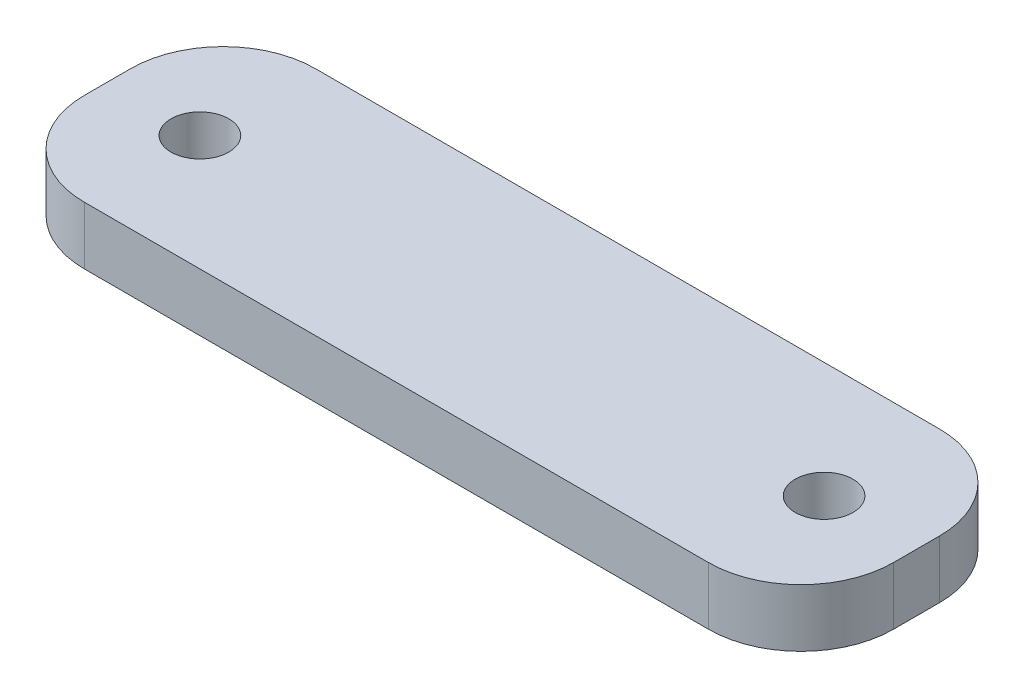
ISO-10303-21;
HEADER;
FILE_DESCRIPTION(('STEP AP214'),'2;1');
FILE_NAME('part.step','',(''),(''),'','','');
FILE_SCHEMA(('AUTOMOTIVE_DESIGN { 1 0 10303 214 1 1 1 1 }'));
ENDSEC;
DATA;
#1=APPLICATION_CONTEXT('core data for automotive mechanical design processes');
#2=APPLICATION_PROTOCOL_DEFINITION('international standard','automotive_design',2000,#1);
#3=PRODUCT_CONTEXT('',#1,'mechanical');
#4=PRODUCT('Part','Part','',(#3));
#5=PRODUCT_RELATED_PRODUCT_CATEGORY('part','',(#4));
#6=PRODUCT_DEFINITION_FORMATION('','',#4);
#7=PRODUCT_DEFINITION_CONTEXT('part definition',#1,'design');
#8=PRODUCT_DEFINITION('design','',#6,#7);
#9=PRODUCT_DEFINITION_SHAPE('','',#8);
#10=(LENGTH_UNIT() NAMED_UNIT(*) SI_UNIT(.MILLI.,.METRE.));
#11=(NAMED_UNIT(*) PLANE_ANGLE_UNIT() SI_UNIT($,.RADIAN.));
#12=(NAMED_UNIT(*) SI_UNIT($,.STERADIAN.) SOLID_ANGLE_UNIT());
#13=UNCERTAINTY_MEASURE_WITH_UNIT(LENGTH_MEASURE(1.E-05),#10,'distance_accuracy_value','');
#14=(GEOMETRIC_REPRESENTATION_CONTEXT(3) GLOBAL_UNCERTAINTY_ASSIGNED_CONTEXT((#13)) GLOBAL_UNIT_ASSIGNED_CONTEXT((#10,
#11,#12)) REPRESENTATION_CONTEXT('',''));
#15=CARTESIAN_POINT('',(0.,0.,0.));
#16=DIRECTION('',(0.,0.,1.));
#17=DIRECTION('',(1.,0.,0.));
#18=AXIS2_PLACEMENT_3D('',#15,#16,#17);
#19=CARTESIAN_POINT('',(8.,5.,12.));
#20=DIRECTION('',(0.,1.,0.));
#21=DIRECTION('',(0.,0.,1.));
#22=AXIS2_PLACEMENT_3D('',#19,#20,#21);
#23=PLANE('',#22);
#24=CARTESIAN_POINT('',(8.00000000000006,5.,10.));
#25=DIRECTION('',(0.,1.,0.));
#26=DIRECTION('',(0.,0.,1.));
#27=AXIS2_PLACEMENT_3D('',#24,#25,#26);
#28=CIRCLE('',#27,2.5);
#29=CARTESIAN_POINT('',(8.00000000000006,5.,12.5));
#30=VERTEX_POINT('',#29);
#31=EDGE_CURVE('E134',#30,#30,#28,.T.);
#32=ORIENTED_EDGE('',*,*,#31,.F.);
#33=EDGE_LOOP('',(#32));
#34=FACE_BOUND('',#33,.T.);
#35=CARTESIAN_POINT('',(8.,5.,12.));
#36=DIRECTION('',(0.,1.,0.));
#37=DIRECTION('',(0.,0.,1.));
#38=AXIS2_PLACEMENT_3D('',#35,#36,#37);
#39=CIRCLE('',#38,8.);
#40=CARTESIAN_POINT('',(0.,5.,11.9999999999999));
#41=VERTEX_POINT('',#40);
#42=CARTESIAN_POINT('',(8.00000000000006,5.,20.));
#43=VERTEX_POINT('',#42);
#44=EDGE_CURVE('E145',#41,#43,#39,.T.);
#45=ORIENTED_EDGE('',*,*,#44,.T.);
#46=DIRECTION('',(1.,0.,0.));
#47=VECTOR('',#46,1.);
#48=CARTESIAN_POINT('',(8.00000000000006,5.,20.));
#49=LINE('',#48,#47);
#50=CARTESIAN_POINT('',(62.,5.,20.));
#51=VERTEX_POINT('',#50);
#52=EDGE_CURVE('E93',#43,#51,#49,.T.);
#53=ORIENTED_EDGE('',*,*,#52,.T.);
#54=CARTESIAN_POINT('',(62.,5.,12.));
#55=DIRECTION('',(0.,1.,0.));
#56=DIRECTION('',(0.,0.,1.));
#57=AXIS2_PLACEMENT_3D('',#54,#55,#56);
#58=CIRCLE('',#57,8.);
#59=CARTESIAN_POINT('',(70.,5.,12.));
#60=VERTEX_POINT('',#59);
#61=EDGE_CURVE('E160',#51,#60,#58,.T.);
#62=ORIENTED_EDGE('',*,*,#61,.T.);
#63=DIRECTION('',(0.,0.,-1.));
#64=VECTOR('',#63,1.);
#65=CARTESIAN_POINT('',(70.,5.,8.));
#66=LINE('',#65,#64);
#67=CARTESIAN_POINT('',(70.,5.,8.));
#68=VERTEX_POINT('',#67);
#69=EDGE_CURVE('E173',#60,#68,#66,.T.);
#70=ORIENTED_EDGE('',*,*,#69,.T.);
#71=CARTESIAN_POINT('',(62.,5.,8.));
#72=DIRECTION('',(0.,1.,0.));
#73=DIRECTION('',(0.,0.,-1.));
#74=AXIS2_PLACEMENT_3D('',#71,#72,#73);
#75=CIRCLE('',#74,8.);
#76=CARTESIAN_POINT('',(62.,5.,0.));
#77=VERTEX_POINT('',#76);
#78=EDGE_CURVE('E112',#68,#77,#75,.T.);
#79=ORIENTED_EDGE('',*,*,#78,.T.);
#80=DIRECTION('',(-1.,0.,0.));
#81=VECTOR('',#80,1.);
#82=CARTESIAN_POINT('',(8.00000000000006,5.,0.));
#83=LINE('',#82,#81);
#84=CARTESIAN_POINT('',(8.00000000000006,5.,0.));
#85=VERTEX_POINT('',#84);
#86=EDGE_CURVE('E106',#77,#85,#83,.T.);
#87=ORIENTED_EDGE('',*,*,#86,.T.);
#88=CARTESIAN_POINT('',(8.,5.,8.));
#89=DIRECTION('',(0.,1.,0.));
#90=DIRECTION('',(0.,0.,1.));
#91=AXIS2_PLACEMENT_3D('',#88,#89,#90);
#92=CIRCLE('',#91,8.);
#93=CARTESIAN_POINT('',(0.,5.,8.00000000000006));
#94=VERTEX_POINT('',#93);
#95=EDGE_CURVE('E110',#85,#94,#92,.T.);
#96=ORIENTED_EDGE('',*,*,#95,.T.);
#97=DIRECTION('',(0.,0.,1.));
#98=VECTOR('',#97,1.);
#99=CARTESIAN_POINT('',(0.,5.,8.00000000000006));
#100=LINE('',#99,#98);
#101=EDGE_CURVE('E50',#94,#41,#100,.T.);
#102=ORIENTED_EDGE('',*,*,#101,.T.);
#103=EDGE_LOOP('',(#45,#53,#62,#70,#79,#87,#96,#102));
#104=FACE_BOUND('',#103,.T.);
#105=CARTESIAN_POINT('',(62.,5.,10.));
#106=DIRECTION('',(0.,1.,0.));
#107=DIRECTION('',(0.,0.,-1.));
#108=AXIS2_PLACEMENT_3D('',#105,#106,#107);
#109=CIRCLE('',#108,2.5);
#110=CARTESIAN_POINT('',(62.,5.,7.5));
#111=VERTEX_POINT('',#110);
#112=EDGE_CURVE('E182',#111,#111,#109,.T.);
#113=ORIENTED_EDGE('',*,*,#112,.F.);
#114=EDGE_LOOP('',(#113));
#115=FACE_BOUND('',#114,.T.);
#116=ADVANCED_FACE('F33',(#34,#104,#115),#23,.T.);
#117=CARTESIAN_POINT('',(8.,0.,12.));
#118=DIRECTION('',(0.,1.,0.));
#119=DIRECTION('',(0.,0.,1.));
#120=AXIS2_PLACEMENT_3D('',#117,#118,#119);
#121=PLANE('',#120);
#122=CARTESIAN_POINT('',(8.,0.,12.));
#123=DIRECTION('',(0.,1.,0.));
#124=DIRECTION('',(0.,0.,1.));
#125=AXIS2_PLACEMENT_3D('',#122,#123,#124);
#126=CIRCLE('',#125,8.);
#127=CARTESIAN_POINT('',(0.,0.,11.9999999999999));
#128=VERTEX_POINT('',#127);
#129=CARTESIAN_POINT('',(8.00000000000006,0.,20.));
#130=VERTEX_POINT('',#129);
#131=EDGE_CURVE('E130',#128,#130,#126,.T.);
#132=ORIENTED_EDGE('',*,*,#131,.F.);
#133=DIRECTION('',(0.,0.,1.));
#134=VECTOR('',#133,1.);
#135=CARTESIAN_POINT('',(0.,0.,8.00000000000006));
#136=LINE('',#135,#134);
#137=CARTESIAN_POINT('',(0.,0.,8.00000000000006));
#138=VERTEX_POINT('',#137);
#139=EDGE_CURVE('E85',#138,#128,#136,.T.);
#140=ORIENTED_EDGE('',*,*,#139,.F.);
#141=CARTESIAN_POINT('',(8.,0.,8.));
#142=DIRECTION('',(0.,1.,0.));
#143=DIRECTION('',(0.,0.,1.));
#144=AXIS2_PLACEMENT_3D('',#141,#142,#143);
#145=CIRCLE('',#144,8.);
#146=CARTESIAN_POINT('',(8.00000000000006,0.,0.));
#147=VERTEX_POINT('',#146);
#148=EDGE_CURVE('E79',#147,#138,#145,.T.);
#149=ORIENTED_EDGE('',*,*,#148,.F.);
#150=DIRECTION('',(-1.,0.,0.));
#151=VECTOR('',#150,1.);
#152=CARTESIAN_POINT('',(8.00000000000006,0.,0.));
#153=LINE('',#152,#151);
#154=CARTESIAN_POINT('',(62.,0.,0.));
#155=VERTEX_POINT('',#154);
#156=EDGE_CURVE('E120',#155,#147,#153,.T.);
#157=ORIENTED_EDGE('',*,*,#156,.F.);
#158=CARTESIAN_POINT('',(62.,0.,8.));
#159=DIRECTION('',(0.,1.,0.));
#160=DIRECTION('',(0.,0.,-1.));
#161=AXIS2_PLACEMENT_3D('',#158,#159,#160);
#162=CIRCLE('',#161,8.);
#163=CARTESIAN_POINT('',(70.,0.,8.));
#164=VERTEX_POINT('',#163);
#165=EDGE_CURVE('E140',#164,#155,#162,.T.);
#166=ORIENTED_EDGE('',*,*,#165,.F.);
#167=DIRECTION('',(0.,0.,-1.));
#168=VECTOR('',#167,1.);
#169=CARTESIAN_POINT('',(70.,0.,8.));
#170=LINE('',#169,#168);
#171=CARTESIAN_POINT('',(70.,0.,12.));
#172=VERTEX_POINT('',#171);
#173=EDGE_CURVE('E138',#172,#164,#170,.T.);
#174=ORIENTED_EDGE('',*,*,#173,.F.);
#175=CARTESIAN_POINT('',(62.,0.,12.));
#176=DIRECTION('',(0.,1.,0.));
#177=DIRECTION('',(0.,0.,1.));
#178=AXIS2_PLACEMENT_3D('',#175,#176,#177);
#179=CIRCLE('',#178,8.);
#180=CARTESIAN_POINT('',(62.,0.,20.));
#181=VERTEX_POINT('',#180);
#182=EDGE_CURVE('E136',#181,#172,#179,.T.);
#183=ORIENTED_EDGE('',*,*,#182,.F.);
#184=DIRECTION('',(1.,0.,0.));
#185=VECTOR('',#184,1.);
#186=CARTESIAN_POINT('',(8.00000000000006,0.,20.));
#187=LINE('',#186,#185);
#188=EDGE_CURVE('E133',#130,#181,#187,.T.);
#189=ORIENTED_EDGE('',*,*,#188,.F.);
#190=EDGE_LOOP('',(#132,#140,#149,#157,#166,#174,#183,#189));
#191=FACE_BOUND('',#190,.T.);
#192=CARTESIAN_POINT('',(8.00000000000006,0.,10.));
#193=DIRECTION('',(0.,1.,0.));
#194=DIRECTION('',(0.,0.,1.));
#195=AXIS2_PLACEMENT_3D('',#192,#193,#194);
#196=CIRCLE('',#195,2.5);
#197=CARTESIAN_POINT('',(8.00000000000006,0.,12.5));
#198=VERTEX_POINT('',#197);
#199=EDGE_CURVE('E179',#198,#198,#196,.T.);
#200=ORIENTED_EDGE('',*,*,#199,.T.);
#201=EDGE_LOOP('',(#200));
#202=FACE_BOUND('',#201,.T.);
#203=CARTESIAN_POINT('',(62.,0.,10.));
#204=DIRECTION('',(0.,1.,0.));
#205=DIRECTION('',(0.,0.,-1.));
#206=AXIS2_PLACEMENT_3D('',#203,#204,#205);
#207=CIRCLE('',#206,2.5);
#208=CARTESIAN_POINT('',(62.,0.,7.5));
#209=VERTEX_POINT('',#208);
#210=EDGE_CURVE('E185',#209,#209,#207,.T.);
#211=ORIENTED_EDGE('',*,*,#210,.T.);
#212=EDGE_LOOP('',(#211));
#213=FACE_BOUND('',#212,.T.);
#214=ADVANCED_FACE('F164',(#191,#202,#213),#121,.F.);
#215=CARTESIAN_POINT('',(8.,5.,12.));
#216=DIRECTION('',(0.,-1.,0.));
#217=DIRECTION('',(0.,0.,-1.));
#218=AXIS2_PLACEMENT_3D('',#215,#216,#217);
#219=CYLINDRICAL_SURFACE('',#218,8.);
#220=ORIENTED_EDGE('',*,*,#131,.T.);
#221=DIRECTION('',(0.,-1.,0.));
#222=VECTOR('',#221,1.);
#223=CARTESIAN_POINT('',(8.00000000000006,5.,20.));
#224=LINE('',#223,#222);
#225=EDGE_CURVE('E11',#43,#130,#224,.T.);
#226=ORIENTED_EDGE('',*,*,#225,.F.);
#227=ORIENTED_EDGE('',*,*,#44,.F.);
#228=DIRECTION('',(0.,-1.,0.));
#229=VECTOR('',#228,1.);
#230=CARTESIAN_POINT('',(0.,5.,11.9999999999999));
#231=LINE('',#230,#229);
#232=EDGE_CURVE('E126',#41,#128,#231,.T.);
#233=ORIENTED_EDGE('',*,*,#232,.T.);
#234=EDGE_LOOP('',(#220,#226,#227,#233));
#235=FACE_BOUND('',#234,.T.);
#236=ADVANCED_FACE('F35',(#235),#219,.T.);
#237=CARTESIAN_POINT('',(8.00000000000006,5.,20.));
#238=DIRECTION('',(0.,0.,-1.));
#239=DIRECTION('',(-1.,0.,0.));
#240=AXIS2_PLACEMENT_3D('',#237,#238,#239);
#241=PLANE('',#240);
#242=ORIENTED_EDGE('',*,*,#188,.T.);
#243=DIRECTION('',(0.,-1.,0.));
#244=VECTOR('',#243,1.);
#245=CARTESIAN_POINT('',(62.,5.,20.));
#246=LINE('',#245,#244);
#247=EDGE_CURVE('E42',#51,#181,#246,.T.);
#248=ORIENTED_EDGE('',*,*,#247,.F.);
#249=ORIENTED_EDGE('',*,*,#52,.F.);
#250=ORIENTED_EDGE('',*,*,#225,.T.);
#251=EDGE_LOOP('',(#242,#248,#249,#250));
#252=FACE_BOUND('',#251,.T.);
#253=ADVANCED_FACE('F217',(#252),#241,.F.);
#254=CARTESIAN_POINT('',(62.,5.,12.));
#255=DIRECTION('',(0.,-1.,0.));
#256=DIRECTION('',(0.,0.,-1.));
#257=AXIS2_PLACEMENT_3D('',#254,#255,#256);
#258=CYLINDRICAL_SURFACE('',#257,8.);
#259=ORIENTED_EDGE('',*,*,#182,.T.);
#260=DIRECTION('',(0.,-1.,0.));
#261=VECTOR('',#260,1.);
#262=CARTESIAN_POINT('',(70.,5.,12.));
#263=LINE('',#262,#261);
#264=EDGE_CURVE('E152',#60,#172,#263,.T.);
#265=ORIENTED_EDGE('',*,*,#264,.F.);
#266=ORIENTED_EDGE('',*,*,#61,.F.);
#267=ORIENTED_EDGE('',*,*,#247,.T.);
#268=EDGE_LOOP('',(#259,#265,#266,#267));
#269=FACE_BOUND('',#268,.T.);
#270=ADVANCED_FACE('F158',(#269),#258,.T.);
#271=CARTESIAN_POINT('',(70.,5.,8.));
#272=DIRECTION('',(-1.,0.,0.));
#273=DIRECTION('',(0.,0.,1.));
#274=AXIS2_PLACEMENT_3D('',#271,#272,#273);
#275=PLANE('',#274);
#276=ORIENTED_EDGE('',*,*,#173,.T.);
#277=DIRECTION('',(0.,-1.,0.));
#278=VECTOR('',#277,1.);
#279=CARTESIAN_POINT('',(70.,5.,8.));
#280=LINE('',#279,#278);
#281=EDGE_CURVE('E149',#68,#164,#280,.T.);
#282=ORIENTED_EDGE('',*,*,#281,.F.);
#283=ORIENTED_EDGE('',*,*,#69,.F.);
#284=ORIENTED_EDGE('',*,*,#264,.T.);
#285=EDGE_LOOP('',(#276,#282,#283,#284));
#286=FACE_BOUND('',#285,.T.);
#287=ADVANCED_FACE('F169',(#286),#275,.F.);
#288=CARTESIAN_POINT('',(62.,5.,8.));
#289=DIRECTION('',(0.,-1.,0.));
#290=DIRECTION('',(0.,0.,-1.));
#291=AXIS2_PLACEMENT_3D('',#288,#289,#290);
#292=CYLINDRICAL_SURFACE('',#291,8.);
#293=ORIENTED_EDGE('',*,*,#165,.T.);
#294=DIRECTION('',(0.,-1.,0.));
#295=VECTOR('',#294,1.);
#296=CARTESIAN_POINT('',(62.,5.,0.));
#297=LINE('',#296,#295);
#298=EDGE_CURVE('E121',#77,#155,#297,.T.);
#299=ORIENTED_EDGE('',*,*,#298,.F.);
#300=ORIENTED_EDGE('',*,*,#78,.F.);
#301=ORIENTED_EDGE('',*,*,#281,.T.);
#302=EDGE_LOOP('',(#293,#299,#300,#301));
#303=FACE_BOUND('',#302,.T.);
#304=ADVANCED_FACE('F172',(#303),#292,.T.);
#305=CARTESIAN_POINT('',(8.00000000000006,5.,0.));
#306=DIRECTION('',(0.,0.,1.));
#307=DIRECTION('',(1.,0.,0.));
#308=AXIS2_PLACEMENT_3D('',#305,#306,#307);
#309=PLANE('',#308);
#310=ORIENTED_EDGE('',*,*,#156,.T.);
#311=DIRECTION('',(0.,-1.,0.));
#312=VECTOR('',#311,1.);
#313=CARTESIAN_POINT('',(8.00000000000006,5.,0.));
#314=LINE('',#313,#312);
#315=EDGE_CURVE('E117',#85,#147,#314,.T.);
#316=ORIENTED_EDGE('',*,*,#315,.F.);
#317=ORIENTED_EDGE('',*,*,#86,.F.);
#318=ORIENTED_EDGE('',*,*,#298,.T.);
#319=EDGE_LOOP('',(#310,#316,#317,#318));
#320=FACE_BOUND('',#319,.T.);
#321=ADVANCED_FACE('F118',(#320),#309,.F.);
#322=CARTESIAN_POINT('',(8.,5.,8.));
#323=DIRECTION('',(0.,-1.,0.));
#324=DIRECTION('',(0.,0.,-1.));
#325=AXIS2_PLACEMENT_3D('',#322,#323,#324);
#326=CYLINDRICAL_SURFACE('',#325,8.);
#327=ORIENTED_EDGE('',*,*,#148,.T.);
#328=DIRECTION('',(0.,-1.,0.));
#329=VECTOR('',#328,1.);
#330=CARTESIAN_POINT('',(0.,5.,8.00000000000006));
#331=LINE('',#330,#329);
#332=EDGE_CURVE('E122',#94,#138,#331,.T.);
#333=ORIENTED_EDGE('',*,*,#332,.F.);
#334=ORIENTED_EDGE('',*,*,#95,.F.);
#335=ORIENTED_EDGE('',*,*,#315,.T.);
#336=EDGE_LOOP('',(#327,#333,#334,#335));
#337=FACE_BOUND('',#336,.T.);
#338=ADVANCED_FACE('F124',(#337),#326,.T.);
#339=CARTESIAN_POINT('',(0.,5.,8.00000000000006));
#340=DIRECTION('',(1.,0.,0.));
#341=DIRECTION('',(0.,0.,-1.));
#342=AXIS2_PLACEMENT_3D('',#339,#340,#341);
#343=PLANE('',#342);
#344=ORIENTED_EDGE('',*,*,#139,.T.);
#345=ORIENTED_EDGE('',*,*,#232,.F.);
#346=ORIENTED_EDGE('',*,*,#101,.F.);
#347=ORIENTED_EDGE('',*,*,#332,.T.);
#348=EDGE_LOOP('',(#344,#345,#346,#347));
#349=FACE_BOUND('',#348,.T.);
#350=ADVANCED_FACE('F205',(#349),#343,.F.);
#351=CARTESIAN_POINT('',(8.00000000000006,5.,10.));
#352=DIRECTION('',(0.,-1.,0.));
#353=DIRECTION('',(0.,0.,-1.));
#354=AXIS2_PLACEMENT_3D('',#351,#352,#353);
#355=CYLINDRICAL_SURFACE('',#354,2.5);
#356=ORIENTED_EDGE('',*,*,#31,.T.);
#357=EDGE_LOOP('',(#356));
#358=FACE_BOUND('',#357,.T.);
#359=ORIENTED_EDGE('',*,*,#199,.F.);
#360=EDGE_LOOP('',(#359));
#361=FACE_BOUND('',#360,.T.);
#362=ADVANCED_FACE('F202',(#358,#361),#355,.F.);
#363=CARTESIAN_POINT('',(62.,5.,10.));
#364=DIRECTION('',(0.,-1.,0.));
#365=DIRECTION('',(0.,0.,-1.));
#366=AXIS2_PLACEMENT_3D('',#363,#364,#365);
#367=CYLINDRICAL_SURFACE('',#366,2.5);
#368=ORIENTED_EDGE('',*,*,#112,.T.);
#369=EDGE_LOOP('',(#368));
#370=FACE_BOUND('',#369,.T.);
#371=ORIENTED_EDGE('',*,*,#210,.F.);
#372=EDGE_LOOP('',(#371));
#373=FACE_BOUND('',#372,.T.);
#374=ADVANCED_FACE('F191',(#370,#373),#367,.F.);
#375=CLOSED_SHELL('',(#116,#214,#236,#253,#270,#287,#304,#321,#338,#350,#362,#374));
#376=MANIFOLD_SOLID_BREP('B2',#375);
#377=ADVANCED_BREP_SHAPE_REPRESENTATION('',(#18,#376),#14);
#378=SHAPE_DEFINITION_REPRESENTATION(#9,#377);
ENDSEC;
END-ISO-10303-21;
